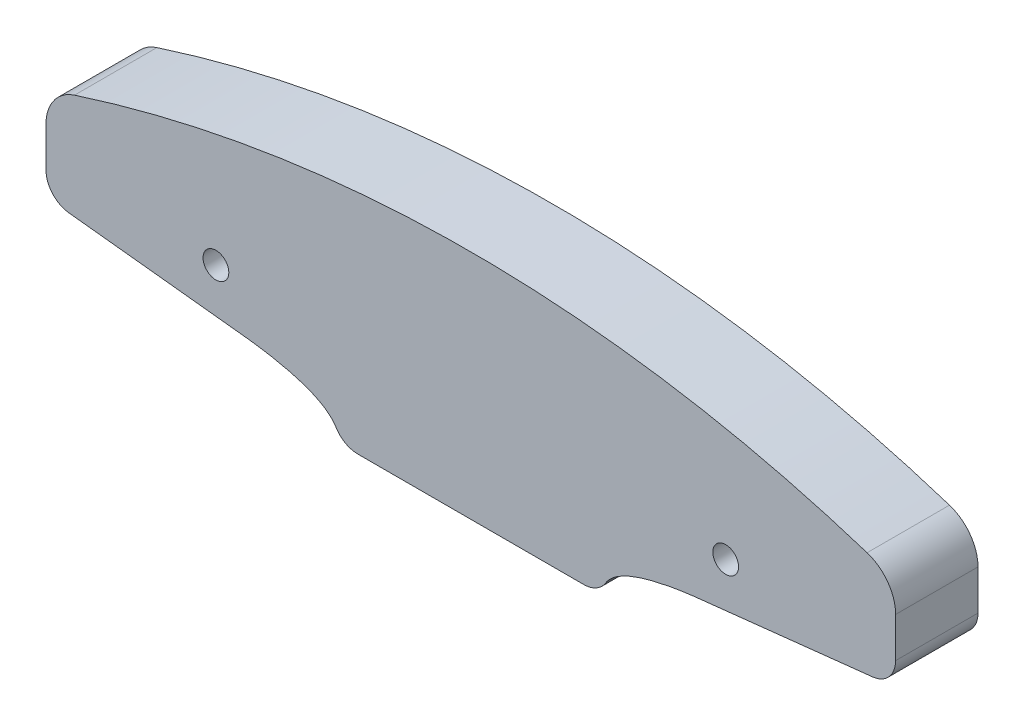
ISO-10303-21;
HEADER;
FILE_DESCRIPTION(('STEP AP214'),'2;1');
FILE_NAME('part.step','',(''),(''),'','','');
FILE_SCHEMA(('AUTOMOTIVE_DESIGN { 1 0 10303 214 1 1 1 1 }'));
ENDSEC;
DATA;
#1=APPLICATION_CONTEXT('core data for automotive mechanical design processes');
#2=APPLICATION_PROTOCOL_DEFINITION('international standard','automotive_design',2000,#1);
#3=PRODUCT_CONTEXT('',#1,'mechanical');
#4=PRODUCT('Part','Part','',(#3));
#5=PRODUCT_RELATED_PRODUCT_CATEGORY('part','',(#4));
#6=PRODUCT_DEFINITION_FORMATION('','',#4);
#7=PRODUCT_DEFINITION_CONTEXT('part definition',#1,'design');
#8=PRODUCT_DEFINITION('design','',#6,#7);
#9=PRODUCT_DEFINITION_SHAPE('','',#8);
#10=(LENGTH_UNIT() NAMED_UNIT(*) SI_UNIT(.MILLI.,.METRE.));
#11=(NAMED_UNIT(*) PLANE_ANGLE_UNIT() SI_UNIT($,.RADIAN.));
#12=(NAMED_UNIT(*) SI_UNIT($,.STERADIAN.) SOLID_ANGLE_UNIT());
#13=UNCERTAINTY_MEASURE_WITH_UNIT(LENGTH_MEASURE(1.E-05),#10,'distance_accuracy_value','');
#14=(GEOMETRIC_REPRESENTATION_CONTEXT(3) GLOBAL_UNCERTAINTY_ASSIGNED_CONTEXT((#13)) GLOBAL_UNIT_ASSIGNED_CONTEXT((#10,
#11,#12)) REPRESENTATION_CONTEXT('',''));
#15=CARTESIAN_POINT('',(0.,0.,0.));
#16=DIRECTION('',(0.,0.,1.));
#17=DIRECTION('',(1.,0.,0.));
#18=AXIS2_PLACEMENT_3D('',#15,#16,#17);
#19=CARTESIAN_POINT('',(25.5,0.,-8.));
#20=DIRECTION('',(0.,-1.,0.));
#21=DIRECTION('',(0.,0.,-1.));
#22=AXIS2_PLACEMENT_3D('',#19,#20,#21);
#23=PLANE('',#22);
#24=DIRECTION('',(1.,0.,0.));
#25=VECTOR('',#24,1.);
#26=CARTESIAN_POINT('',(25.5,0.,8.));
#27=LINE('',#26,#25);
#28=CARTESIAN_POINT('',(-21.9183722338467,0.,8.));
#29=VERTEX_POINT('',#28);
#30=CARTESIAN_POINT('',(21.9183722338467,0.,8.));
#31=VERTEX_POINT('',#30);
#32=EDGE_CURVE('E163',#29,#31,#27,.T.);
#33=ORIENTED_EDGE('',*,*,#32,.F.);
#34=DIRECTION('',(0.,0.,-1.));
#35=VECTOR('',#34,1.);
#36=CARTESIAN_POINT('',(-21.9183722338467,0.,-8.));
#37=LINE('',#36,#35);
#38=CARTESIAN_POINT('',(-21.9183722338467,0.,-8.));
#39=VERTEX_POINT('',#38);
#40=EDGE_CURVE('E324',#29,#39,#37,.T.);
#41=ORIENTED_EDGE('',*,*,#40,.T.);
#42=DIRECTION('',(1.,0.,0.));
#43=VECTOR('',#42,1.);
#44=CARTESIAN_POINT('',(25.5,0.,-8.));
#45=LINE('',#44,#43);
#46=CARTESIAN_POINT('',(21.9183722338467,0.,-8.));
#47=VERTEX_POINT('',#46);
#48=EDGE_CURVE('E239',#39,#47,#45,.T.);
#49=ORIENTED_EDGE('',*,*,#48,.T.);
#50=DIRECTION('',(0.,0.,1.));
#51=VECTOR('',#50,1.);
#52=CARTESIAN_POINT('',(21.9183722338467,0.,-8.));
#53=LINE('',#52,#51);
#54=EDGE_CURVE('E320',#47,#31,#53,.T.);
#55=ORIENTED_EDGE('',*,*,#54,.T.);
#56=EDGE_LOOP('',(#33,#41,#49,#55));
#57=FACE_BOUND('',#56,.T.);
#58=ADVANCED_FACE('F39',(#57),#23,.T.);
#59=CARTESIAN_POINT('',(0.,-205.080357142857,-8.));
#60=DIRECTION('',(0.,0.,1.));
#61=DIRECTION('',(1.,0.,0.));
#62=AXIS2_PLACEMENT_3D('',#59,#60,#61);
#63=CYLINDRICAL_SURFACE('',#62,250.080357142857);
#64=CARTESIAN_POINT('',(0.,-205.080357142857,-8.));
#65=DIRECTION('',(0.,0.,1.));
#66=DIRECTION('',(-1.,0.,0.));
#67=AXIS2_PLACEMENT_3D('',#64,#65,#66);
#68=CIRCLE('',#67,250.080357142857);
#69=CARTESIAN_POINT('',(76.9619924021687,32.862990640155,-8.));
#70=VERTEX_POINT('',#69);
#71=CARTESIAN_POINT('',(-76.9619924021687,32.862990640155,-8.));
#72=VERTEX_POINT('',#71);
#73=EDGE_CURVE('E250',#70,#72,#68,.T.);
#74=ORIENTED_EDGE('',*,*,#73,.T.);
#75=DIRECTION('',(0.,0.,1.));
#76=VECTOR('',#75,1.);
#77=CARTESIAN_POINT('',(-76.9619924021687,32.8629906401551,-8.));
#78=LINE('',#77,#76);
#79=CARTESIAN_POINT('',(-76.9619924021687,32.862990640155,8.));
#80=VERTEX_POINT('',#79);
#81=EDGE_CURVE('E261',#72,#80,#78,.T.);
#82=ORIENTED_EDGE('',*,*,#81,.T.);
#83=CARTESIAN_POINT('',(0.,-205.080357142857,8.));
#84=DIRECTION('',(0.,0.,1.));
#85=DIRECTION('',(-1.,0.,0.));
#86=AXIS2_PLACEMENT_3D('',#83,#84,#85);
#87=CIRCLE('',#86,250.080357142857);
#88=CARTESIAN_POINT('',(76.9619924021687,32.862990640155,8.));
#89=VERTEX_POINT('',#88);
#90=EDGE_CURVE('E353',#89,#80,#87,.T.);
#91=ORIENTED_EDGE('',*,*,#90,.F.);
#92=DIRECTION('',(0.,0.,1.));
#93=VECTOR('',#92,1.);
#94=CARTESIAN_POINT('',(76.9619924021687,32.8629906401551,-8.));
#95=LINE('',#94,#93);
#96=EDGE_CURVE('E258',#89,#70,#95,.F.);
#97=ORIENTED_EDGE('',*,*,#96,.T.);
#98=EDGE_LOOP('',(#74,#82,#91,#97));
#99=FACE_BOUND('',#98,.T.);
#100=ADVANCED_FACE('F215',(#99),#63,.T.);
#101=CARTESIAN_POINT('',(82.5,31.,-8.));
#102=DIRECTION('',(1.,0.,0.));
#103=DIRECTION('',(0.,0.,-1.));
#104=AXIS2_PLACEMENT_3D('',#101,#102,#103);
#105=PLANE('',#104);
#106=DIRECTION('',(0.,1.,0.));
#107=VECTOR('',#106,1.);
#108=CARTESIAN_POINT('',(82.5,31.,8.));
#109=LINE('',#108,#107);
#110=CARTESIAN_POINT('',(82.5,17.4829472913388,8.));
#111=VERTEX_POINT('',#110);
#112=CARTESIAN_POINT('',(82.5,25.2512501419731,8.));
#113=VERTEX_POINT('',#112);
#114=EDGE_CURVE('E351',#111,#113,#109,.T.);
#115=ORIENTED_EDGE('',*,*,#114,.F.);
#116=DIRECTION('',(0.,0.,1.));
#117=VECTOR('',#116,1.);
#118=CARTESIAN_POINT('',(82.5,17.4829472913388,-8.));
#119=LINE('',#118,#117);
#120=CARTESIAN_POINT('',(82.5,17.4829472913388,-8.));
#121=VERTEX_POINT('',#120);
#122=EDGE_CURVE('E309',#111,#121,#119,.F.);
#123=ORIENTED_EDGE('',*,*,#122,.T.);
#124=DIRECTION('',(0.,1.,0.));
#125=VECTOR('',#124,1.);
#126=CARTESIAN_POINT('',(82.5,31.,-8.));
#127=LINE('',#126,#125);
#128=CARTESIAN_POINT('',(82.5,25.2512501419731,-8.));
#129=VERTEX_POINT('',#128);
#130=EDGE_CURVE('E247',#121,#129,#127,.T.);
#131=ORIENTED_EDGE('',*,*,#130,.T.);
#132=DIRECTION('',(0.,0.,1.));
#133=VECTOR('',#132,1.);
#134=CARTESIAN_POINT('',(82.5,25.2512501419731,-8.));
#135=LINE('',#134,#133);
#136=EDGE_CURVE('E283',#129,#113,#135,.T.);
#137=ORIENTED_EDGE('',*,*,#136,.T.);
#138=EDGE_LOOP('',(#115,#123,#131,#137));
#139=FACE_BOUND('',#138,.T.);
#140=ADVANCED_FACE('F218',(#139),#105,.T.);
#141=CARTESIAN_POINT('',(82.5,13.,-8.));
#142=DIRECTION('',(0.108725714421789,-0.994071787660967,0.));
#143=DIRECTION('',(0.994071787660967,0.108725714421789,0.));
#144=AXIS2_PLACEMENT_3D('',#141,#142,#143);
#145=PLANE('',#144);
#146=DIRECTION('',(0.994071787660967,0.108725714421789,0.));
#147=VECTOR('',#146,1.);
#148=CARTESIAN_POINT('',(82.5,13.,-8.));
#149=LINE('',#148,#147);
#150=CARTESIAN_POINT('',(43.1656829731963,8.69784418679131,-8.));
#151=VERTEX_POINT('',#150);
#152=CARTESIAN_POINT('',(78.0436285721089,12.512588353034,-8.));
#153=VERTEX_POINT('',#152);
#154=EDGE_CURVE('E238',#151,#153,#149,.T.);
#155=ORIENTED_EDGE('',*,*,#154,.T.);
#156=DIRECTION('',(0.,0.,1.));
#157=VECTOR('',#156,1.);
#158=CARTESIAN_POINT('',(78.0436285721089,12.512588353034,-8.));
#159=LINE('',#158,#157);
#160=CARTESIAN_POINT('',(78.0436285721089,12.512588353034,8.));
#161=VERTEX_POINT('',#160);
#162=EDGE_CURVE('E305',#153,#161,#159,.T.);
#163=ORIENTED_EDGE('',*,*,#162,.T.);
#164=DIRECTION('',(0.994071787660967,0.108725714421789,0.));
#165=VECTOR('',#164,1.);
#166=CARTESIAN_POINT('',(82.5,13.,8.));
#167=LINE('',#166,#165);
#168=CARTESIAN_POINT('',(43.1656829731963,8.69784418679131,8.));
#169=VERTEX_POINT('',#168);
#170=EDGE_CURVE('E340',#169,#161,#167,.T.);
#171=ORIENTED_EDGE('',*,*,#170,.F.);
#172=DIRECTION('',(0.,0.,1.));
#173=VECTOR('',#172,1.);
#174=CARTESIAN_POINT('',(43.1656829731963,8.69784418679131,-8.));
#175=LINE('',#174,#173);
#176=EDGE_CURVE('E254',#151,#169,#175,.T.);
#177=ORIENTED_EDGE('',*,*,#176,.F.);
#178=EDGE_LOOP('',(#155,#163,#171,#177));
#179=FACE_BOUND('',#178,.T.);
#180=ADVANCED_FACE('F222',(#179),#145,.T.);
#181=CARTESIAN_POINT('',(25.5,0.,-8.));
#182=CARTESIAN_POINT('',(25.5,6.5,-8.));
#183=CARTESIAN_POINT('',(43.1656829731963,8.69784418679131,-8.));
#184=B_SPLINE_CURVE_WITH_KNOTS('',2,(#181,#182,#183),.UNSPECIFIED.,.F.,.F.,(3,3),(0.,1.),.UNSPECIFIED.);
#185=DIRECTION('',(0.,0.,1.));
#186=VECTOR('',#185,1.);
#187=SURFACE_OF_LINEAR_EXTRUSION('',#184,#186);
#188=CARTESIAN_POINT('',(25.5,0.,8.));
#189=CARTESIAN_POINT('',(25.5,6.5,8.));
#190=CARTESIAN_POINT('',(43.1656829731963,8.69784418679131,8.));
#191=B_SPLINE_CURVE_WITH_KNOTS('',2,(#188,#189,#190),.UNSPECIFIED.,.F.,.F.,(3,3),(0.,1.),.UNSPECIFIED.);
#192=CARTESIAN_POINT('',(26.1807987103924,2.3862439800083,8.));
#193=VERTEX_POINT('',#192);
#194=EDGE_CURVE('E338',#193,#169,#191,.T.);
#195=ORIENTED_EDGE('',*,*,#194,.F.);
#196=DIRECTION('',(0.,0.,1.));
#197=VECTOR('',#196,1.);
#198=CARTESIAN_POINT('',(26.1807987103924,2.3862439800083,8.));
#199=LINE('',#198,#197);
#200=CARTESIAN_POINT('',(26.1807987103924,2.3862439800083,-8.));
#201=VERTEX_POINT('',#200);
#202=EDGE_CURVE('E11',#193,#201,#199,.F.);
#203=ORIENTED_EDGE('',*,*,#202,.T.);
#204=EDGE_CURVE('E231',#201,#151,#184,.T.);
#205=ORIENTED_EDGE('',*,*,#204,.T.);
#206=ORIENTED_EDGE('',*,*,#176,.T.);
#207=EDGE_LOOP('',(#195,#203,#205,#206));
#208=FACE_BOUND('',#207,.T.);
#209=ADVANCED_FACE('F213',(#208),#187,.T.);
#210=CARTESIAN_POINT('',(0.,-205.080357142857,-8.));
#211=DIRECTION('',(0.,0.,-1.));
#212=DIRECTION('',(-1.,0.,0.));
#213=AXIS2_PLACEMENT_3D('',#210,#211,#212);
#214=PLANE('',#213);
#215=CARTESIAN_POINT('',(-49.5,18.,-8.));
#216=DIRECTION('',(0.,0.,-1.));
#217=DIRECTION('',(-1.,0.,0.));
#218=AXIS2_PLACEMENT_3D('',#215,#216,#217);
#219=CIRCLE('',#218,2.5);
#220=CARTESIAN_POINT('',(-52.,18.,-8.));
#221=VERTEX_POINT('',#220);
#222=EDGE_CURVE('E491',#221,#221,#219,.T.);
#223=ORIENTED_EDGE('',*,*,#222,.F.);
#224=EDGE_LOOP('',(#223));
#225=FACE_BOUND('',#224,.T.);
#226=CARTESIAN_POINT('',(49.5,18.,-8.));
#227=DIRECTION('',(0.,0.,1.));
#228=DIRECTION('',(1.,0.,0.));
#229=AXIS2_PLACEMENT_3D('',#226,#227,#228);
#230=CIRCLE('',#229,2.5);
#231=CARTESIAN_POINT('',(52.,18.,-8.));
#232=VERTEX_POINT('',#231);
#233=EDGE_CURVE('E173',#232,#232,#230,.T.);
#234=ORIENTED_EDGE('',*,*,#233,.T.);
#235=EDGE_LOOP('',(#234));
#236=FACE_BOUND('',#235,.T.);
#237=ORIENTED_EDGE('',*,*,#48,.F.);
#238=CARTESIAN_POINT('',(-21.9183722338467,5.,-8.));
#239=DIRECTION('',(0.,0.,-1.));
#240=DIRECTION('',(-1.,0.,0.));
#241=AXIS2_PLACEMENT_3D('',#238,#239,#240);
#242=CIRCLE('',#241,5.);
#243=CARTESIAN_POINT('',(-26.1807987103924,2.38624398000829,-8.));
#244=VERTEX_POINT('',#243);
#245=EDGE_CURVE('E48',#39,#244,#242,.T.);
#246=ORIENTED_EDGE('',*,*,#245,.T.);
#247=CARTESIAN_POINT('',(-25.5,0.,-8.));
#248=CARTESIAN_POINT('',(-25.5,6.5,-8.));
#249=CARTESIAN_POINT('',(-43.1656829731963,8.69784418679131,-8.));
#250=B_SPLINE_CURVE_WITH_KNOTS('',2,(#247,#248,#249),.UNSPECIFIED.,.F.,.F.,(3,3),(0.,1.),.UNSPECIFIED.);
#251=CARTESIAN_POINT('',(-43.1656829731963,8.69784418679131,-8.));
#252=VERTEX_POINT('',#251);
#253=EDGE_CURVE('E164',#244,#252,#250,.T.);
#254=ORIENTED_EDGE('',*,*,#253,.T.);
#255=DIRECTION('',(-0.994071787660967,0.108725714421789,0.));
#256=VECTOR('',#255,1.);
#257=CARTESIAN_POINT('',(-82.5,13.,-8.));
#258=LINE('',#257,#256);
#259=CARTESIAN_POINT('',(-78.0436285721089,12.512588353034,-8.));
#260=VERTEX_POINT('',#259);
#261=EDGE_CURVE('E161',#252,#260,#258,.T.);
#262=ORIENTED_EDGE('',*,*,#261,.T.);
#263=CARTESIAN_POINT('',(-77.5,17.4829472913388,-8.));
#264=DIRECTION('',(0.,0.,-1.));
#265=DIRECTION('',(-1.,0.,0.));
#266=AXIS2_PLACEMENT_3D('',#263,#264,#265);
#267=CIRCLE('',#266,5.);
#268=CARTESIAN_POINT('',(-82.5,17.4829472913388,-8.));
#269=VERTEX_POINT('',#268);
#270=EDGE_CURVE('E302',#260,#269,#267,.T.);
#271=ORIENTED_EDGE('',*,*,#270,.T.);
#272=DIRECTION('',(0.,1.,0.));
#273=VECTOR('',#272,1.);
#274=CARTESIAN_POINT('',(-82.5,31.,-8.));
#275=LINE('',#274,#273);
#276=CARTESIAN_POINT('',(-82.5,25.2512501419731,-8.));
#277=VERTEX_POINT('',#276);
#278=EDGE_CURVE('E153',#269,#277,#275,.T.);
#279=ORIENTED_EDGE('',*,*,#278,.T.);
#280=CARTESIAN_POINT('',(-74.5,25.2512501419731,-8.));
#281=DIRECTION('',(0.,0.,-1.));
#282=DIRECTION('',(-1.,0.,0.));
#283=AXIS2_PLACEMENT_3D('',#280,#281,#282);
#284=CIRCLE('',#283,8.);
#285=EDGE_CURVE('E280',#277,#72,#284,.T.);
#286=ORIENTED_EDGE('',*,*,#285,.T.);
#287=ORIENTED_EDGE('',*,*,#73,.F.);
#288=CARTESIAN_POINT('',(74.5,25.2512501419731,-8.));
#289=DIRECTION('',(0.,0.,-1.));
#290=DIRECTION('',(-1.,0.,0.));
#291=AXIS2_PLACEMENT_3D('',#288,#289,#290);
#292=CIRCLE('',#291,8.);
#293=EDGE_CURVE('E276',#70,#129,#292,.T.);
#294=ORIENTED_EDGE('',*,*,#293,.T.);
#295=ORIENTED_EDGE('',*,*,#130,.F.);
#296=CARTESIAN_POINT('',(77.5,17.4829472913388,-8.));
#297=DIRECTION('',(0.,0.,-1.));
#298=DIRECTION('',(-1.,0.,0.));
#299=AXIS2_PLACEMENT_3D('',#296,#297,#298);
#300=CIRCLE('',#299,5.);
#301=EDGE_CURVE('E299',#121,#153,#300,.T.);
#302=ORIENTED_EDGE('',*,*,#301,.T.);
#303=ORIENTED_EDGE('',*,*,#154,.F.);
#304=ORIENTED_EDGE('',*,*,#204,.F.);
#305=CARTESIAN_POINT('',(21.9183722338467,5.00000000000001,-8.));
#306=DIRECTION('',(0.,0.,-1.));
#307=DIRECTION('',(-1.,0.,0.));
#308=AXIS2_PLACEMENT_3D('',#305,#306,#307);
#309=CIRCLE('',#308,5.);
#310=EDGE_CURVE('E60',#201,#47,#309,.T.);
#311=ORIENTED_EDGE('',*,*,#310,.T.);
#312=EDGE_LOOP('',(#237,#246,#254,#262,#271,#279,#286,#287,#294,#295,#302,#303,#304,#311));
#313=FACE_BOUND('',#312,.T.);
#314=ADVANCED_FACE('F209',(#225,#236,#313),#214,.T.);
#315=CARTESIAN_POINT('',(0.,-205.080357142857,8.));
#316=DIRECTION('',(0.,0.,-1.));
#317=DIRECTION('',(-1.,0.,0.));
#318=AXIS2_PLACEMENT_3D('',#315,#316,#317);
#319=PLANE('',#318);
#320=CARTESIAN_POINT('',(-49.5,18.,8.));
#321=DIRECTION('',(0.,0.,-1.));
#322=DIRECTION('',(-1.,0.,0.));
#323=AXIS2_PLACEMENT_3D('',#320,#321,#322);
#324=CIRCLE('',#323,2.5);
#325=CARTESIAN_POINT('',(-52.,18.,8.));
#326=VERTEX_POINT('',#325);
#327=EDGE_CURVE('E494',#326,#326,#324,.T.);
#328=ORIENTED_EDGE('',*,*,#327,.T.);
#329=EDGE_LOOP('',(#328));
#330=FACE_BOUND('',#329,.T.);
#331=CARTESIAN_POINT('',(49.5,18.,8.));
#332=DIRECTION('',(0.,0.,1.));
#333=DIRECTION('',(1.,0.,0.));
#334=AXIS2_PLACEMENT_3D('',#331,#332,#333);
#335=CIRCLE('',#334,2.5);
#336=CARTESIAN_POINT('',(52.,18.,8.));
#337=VERTEX_POINT('',#336);
#338=EDGE_CURVE('E498',#337,#337,#335,.T.);
#339=ORIENTED_EDGE('',*,*,#338,.F.);
#340=EDGE_LOOP('',(#339));
#341=FACE_BOUND('',#340,.T.);
#342=CARTESIAN_POINT('',(-25.5,0.,8.));
#343=CARTESIAN_POINT('',(-25.5,6.5,8.));
#344=CARTESIAN_POINT('',(-43.1656829731963,8.69784418679131,8.));
#345=B_SPLINE_CURVE_WITH_KNOTS('',2,(#342,#343,#344),.UNSPECIFIED.,.F.,.F.,(3,3),(0.,1.),.UNSPECIFIED.);
#346=CARTESIAN_POINT('',(-26.1807987103924,2.38624398000829,8.));
#347=VERTEX_POINT('',#346);
#348=CARTESIAN_POINT('',(-43.1656829731963,8.69784418679131,8.));
#349=VERTEX_POINT('',#348);
#350=EDGE_CURVE('E142',#347,#349,#345,.T.);
#351=ORIENTED_EDGE('',*,*,#350,.F.);
#352=CARTESIAN_POINT('',(-21.9183722338467,5.,8.));
#353=DIRECTION('',(0.,0.,-1.));
#354=DIRECTION('',(-1.,0.,0.));
#355=AXIS2_PLACEMENT_3D('',#352,#353,#354);
#356=CIRCLE('',#355,5.);
#357=EDGE_CURVE('E317',#347,#29,#356,.F.);
#358=ORIENTED_EDGE('',*,*,#357,.T.);
#359=ORIENTED_EDGE('',*,*,#32,.T.);
#360=CARTESIAN_POINT('',(21.9183722338467,5.00000000000001,8.));
#361=DIRECTION('',(0.,0.,-1.));
#362=DIRECTION('',(-1.,0.,0.));
#363=AXIS2_PLACEMENT_3D('',#360,#361,#362);
#364=CIRCLE('',#363,5.);
#365=EDGE_CURVE('E314',#31,#193,#364,.F.);
#366=ORIENTED_EDGE('',*,*,#365,.T.);
#367=ORIENTED_EDGE('',*,*,#194,.T.);
#368=ORIENTED_EDGE('',*,*,#170,.T.);
#369=CARTESIAN_POINT('',(77.5,17.4829472913388,8.));
#370=DIRECTION('',(0.,0.,-1.));
#371=DIRECTION('',(-1.,0.,0.));
#372=AXIS2_PLACEMENT_3D('',#369,#370,#371);
#373=CIRCLE('',#372,5.);
#374=EDGE_CURVE('E291',#161,#111,#373,.F.);
#375=ORIENTED_EDGE('',*,*,#374,.T.);
#376=ORIENTED_EDGE('',*,*,#114,.T.);
#377=CARTESIAN_POINT('',(74.5,25.2512501419731,8.));
#378=DIRECTION('',(0.,0.,-1.));
#379=DIRECTION('',(-1.,0.,0.));
#380=AXIS2_PLACEMENT_3D('',#377,#378,#379);
#381=CIRCLE('',#380,8.);
#382=EDGE_CURVE('E265',#113,#89,#381,.F.);
#383=ORIENTED_EDGE('',*,*,#382,.T.);
#384=ORIENTED_EDGE('',*,*,#90,.T.);
#385=CARTESIAN_POINT('',(-74.5,25.2512501419731,8.));
#386=DIRECTION('',(0.,0.,-1.));
#387=DIRECTION('',(-1.,0.,0.));
#388=AXIS2_PLACEMENT_3D('',#385,#386,#387);
#389=CIRCLE('',#388,8.);
#390=CARTESIAN_POINT('',(-82.5,25.2512501419731,8.));
#391=VERTEX_POINT('',#390);
#392=EDGE_CURVE('E268',#80,#391,#389,.F.);
#393=ORIENTED_EDGE('',*,*,#392,.T.);
#394=DIRECTION('',(0.,1.,0.));
#395=VECTOR('',#394,1.);
#396=CARTESIAN_POINT('',(-82.5,31.,8.));
#397=LINE('',#396,#395);
#398=CARTESIAN_POINT('',(-82.5,17.4829472913388,8.));
#399=VERTEX_POINT('',#398);
#400=EDGE_CURVE('E170',#399,#391,#397,.T.);
#401=ORIENTED_EDGE('',*,*,#400,.F.);
#402=CARTESIAN_POINT('',(-77.5,17.4829472913388,8.));
#403=DIRECTION('',(0.,0.,-1.));
#404=DIRECTION('',(-1.,0.,0.));
#405=AXIS2_PLACEMENT_3D('',#402,#403,#404);
#406=CIRCLE('',#405,5.);
#407=CARTESIAN_POINT('',(-78.0436285721089,12.512588353034,8.));
#408=VERTEX_POINT('',#407);
#409=EDGE_CURVE('E168',#399,#408,#406,.F.);
#410=ORIENTED_EDGE('',*,*,#409,.T.);
#411=DIRECTION('',(-0.994071787660967,0.108725714421789,0.));
#412=VECTOR('',#411,1.);
#413=CARTESIAN_POINT('',(-82.5,13.,8.));
#414=LINE('',#413,#412);
#415=EDGE_CURVE('E154',#349,#408,#414,.T.);
#416=ORIENTED_EDGE('',*,*,#415,.F.);
#417=EDGE_LOOP('',(#351,#358,#359,#366,#367,#368,#375,#376,#383,#384,#393,#401,#410,#416));
#418=FACE_BOUND('',#417,.T.);
#419=ADVANCED_FACE('F166',(#330,#341,#418),#319,.F.);
#420=DIRECTION('',(0.,0.,1.));
#421=VECTOR('',#420,1.);
#422=SURFACE_OF_LINEAR_EXTRUSION('',#250,#421);
#423=ORIENTED_EDGE('',*,*,#253,.F.);
#424=DIRECTION('',(0.,0.,1.));
#425=VECTOR('',#424,1.);
#426=CARTESIAN_POINT('',(-26.1807987103924,2.3862439800083,-8.));
#427=LINE('',#426,#425);
#428=EDGE_CURVE('E149',#244,#347,#427,.T.);
#429=ORIENTED_EDGE('',*,*,#428,.T.);
#430=ORIENTED_EDGE('',*,*,#350,.T.);
#431=DIRECTION('',(0.,0.,1.));
#432=VECTOR('',#431,1.);
#433=CARTESIAN_POINT('',(-43.1656829731963,8.69784418679131,-8.));
#434=LINE('',#433,#432);
#435=EDGE_CURVE('E146',#252,#349,#434,.T.);
#436=ORIENTED_EDGE('',*,*,#435,.F.);
#437=EDGE_LOOP('',(#423,#429,#430,#436));
#438=FACE_BOUND('',#437,.T.);
#439=ADVANCED_FACE('F145',(#438),#422,.F.);
#440=CARTESIAN_POINT('',(-82.5,13.,-8.));
#441=DIRECTION('',(0.108725714421789,0.994071787660967,0.));
#442=DIRECTION('',(-0.994071787660967,0.108725714421789,0.));
#443=AXIS2_PLACEMENT_3D('',#440,#441,#442);
#444=PLANE('',#443);
#445=ORIENTED_EDGE('',*,*,#415,.T.);
#446=DIRECTION('',(0.,0.,1.));
#447=VECTOR('',#446,1.);
#448=CARTESIAN_POINT('',(-78.0436285721089,12.512588353034,-8.));
#449=LINE('',#448,#447);
#450=EDGE_CURVE('E296',#408,#260,#449,.F.);
#451=ORIENTED_EDGE('',*,*,#450,.T.);
#452=ORIENTED_EDGE('',*,*,#261,.F.);
#453=ORIENTED_EDGE('',*,*,#435,.T.);
#454=EDGE_LOOP('',(#445,#451,#452,#453));
#455=FACE_BOUND('',#454,.T.);
#456=ADVANCED_FACE('F158',(#455),#444,.F.);
#457=CARTESIAN_POINT('',(-82.5,31.,-8.));
#458=DIRECTION('',(1.,0.,0.));
#459=DIRECTION('',(0.,0.,-1.));
#460=AXIS2_PLACEMENT_3D('',#457,#458,#459);
#461=PLANE('',#460);
#462=ORIENTED_EDGE('',*,*,#278,.F.);
#463=DIRECTION('',(0.,0.,1.));
#464=VECTOR('',#463,1.);
#465=CARTESIAN_POINT('',(-82.5,17.4829472913388,-8.));
#466=LINE('',#465,#464);
#467=EDGE_CURVE('E287',#269,#399,#466,.T.);
#468=ORIENTED_EDGE('',*,*,#467,.T.);
#469=ORIENTED_EDGE('',*,*,#400,.T.);
#470=DIRECTION('',(0.,0.,-1.));
#471=VECTOR('',#470,1.);
#472=CARTESIAN_POINT('',(-82.5,25.2512501419731,-8.));
#473=LINE('',#472,#471);
#474=EDGE_CURVE('E272',#391,#277,#473,.T.);
#475=ORIENTED_EDGE('',*,*,#474,.T.);
#476=EDGE_LOOP('',(#462,#468,#469,#475));
#477=FACE_BOUND('',#476,.T.);
#478=ADVANCED_FACE('F202',(#477),#461,.F.);
#479=CARTESIAN_POINT('',(-74.5,25.2512501419731,-8.));
#480=DIRECTION('',(0.,0.,1.));
#481=DIRECTION('',(1.,0.,0.));
#482=AXIS2_PLACEMENT_3D('',#479,#480,#481);
#483=CYLINDRICAL_SURFACE('',#482,8.);
#484=ORIENTED_EDGE('',*,*,#285,.F.);
#485=ORIENTED_EDGE('',*,*,#474,.F.);
#486=ORIENTED_EDGE('',*,*,#392,.F.);
#487=ORIENTED_EDGE('',*,*,#81,.F.);
#488=EDGE_LOOP('',(#484,#485,#486,#487));
#489=FACE_BOUND('',#488,.T.);
#490=ADVANCED_FACE('F205',(#489),#483,.T.);
#491=CARTESIAN_POINT('',(74.5,25.2512501419731,-8.));
#492=DIRECTION('',(0.,0.,1.));
#493=DIRECTION('',(1.,0.,0.));
#494=AXIS2_PLACEMENT_3D('',#491,#492,#493);
#495=CYLINDRICAL_SURFACE('',#494,8.);
#496=ORIENTED_EDGE('',*,*,#293,.F.);
#497=ORIENTED_EDGE('',*,*,#96,.F.);
#498=ORIENTED_EDGE('',*,*,#382,.F.);
#499=ORIENTED_EDGE('',*,*,#136,.F.);
#500=EDGE_LOOP('',(#496,#497,#498,#499));
#501=FACE_BOUND('',#500,.T.);
#502=ADVANCED_FACE('F375',(#501),#495,.T.);
#503=CARTESIAN_POINT('',(-77.5,17.4829472913388,-8.));
#504=DIRECTION('',(0.,0.,1.));
#505=DIRECTION('',(1.,0.,0.));
#506=AXIS2_PLACEMENT_3D('',#503,#504,#505);
#507=CYLINDRICAL_SURFACE('',#506,5.);
#508=ORIENTED_EDGE('',*,*,#270,.F.);
#509=ORIENTED_EDGE('',*,*,#450,.F.);
#510=ORIENTED_EDGE('',*,*,#409,.F.);
#511=ORIENTED_EDGE('',*,*,#467,.F.);
#512=EDGE_LOOP('',(#508,#509,#510,#511));
#513=FACE_BOUND('',#512,.T.);
#514=ADVANCED_FACE('F384',(#513),#507,.T.);
#515=CARTESIAN_POINT('',(77.5,17.4829472913388,-8.));
#516=DIRECTION('',(0.,0.,1.));
#517=DIRECTION('',(1.,0.,0.));
#518=AXIS2_PLACEMENT_3D('',#515,#516,#517);
#519=CYLINDRICAL_SURFACE('',#518,5.);
#520=ORIENTED_EDGE('',*,*,#301,.F.);
#521=ORIENTED_EDGE('',*,*,#122,.F.);
#522=ORIENTED_EDGE('',*,*,#374,.F.);
#523=ORIENTED_EDGE('',*,*,#162,.F.);
#524=EDGE_LOOP('',(#520,#521,#522,#523));
#525=FACE_BOUND('',#524,.T.);
#526=ADVANCED_FACE('F370',(#525),#519,.T.);
#527=CARTESIAN_POINT('',(-21.9183722338467,5.,0.));
#528=DIRECTION('',(0.,0.,1.));
#529=DIRECTION('',(1.,0.,0.));
#530=AXIS2_PLACEMENT_3D('',#527,#528,#529);
#531=CYLINDRICAL_SURFACE('',#530,5.);
#532=ORIENTED_EDGE('',*,*,#245,.F.);
#533=ORIENTED_EDGE('',*,*,#40,.F.);
#534=ORIENTED_EDGE('',*,*,#357,.F.);
#535=ORIENTED_EDGE('',*,*,#428,.F.);
#536=EDGE_LOOP('',(#532,#533,#534,#535));
#537=FACE_BOUND('',#536,.T.);
#538=ADVANCED_FACE('F332',(#537),#531,.T.);
#539=CARTESIAN_POINT('',(21.9183722338467,5.00000000000001,0.));
#540=DIRECTION('',(0.,0.,1.));
#541=DIRECTION('',(1.,0.,0.));
#542=AXIS2_PLACEMENT_3D('',#539,#540,#541);
#543=CYLINDRICAL_SURFACE('',#542,5.);
#544=ORIENTED_EDGE('',*,*,#310,.F.);
#545=ORIENTED_EDGE('',*,*,#202,.F.);
#546=ORIENTED_EDGE('',*,*,#365,.F.);
#547=ORIENTED_EDGE('',*,*,#54,.F.);
#548=EDGE_LOOP('',(#544,#545,#546,#547));
#549=FACE_BOUND('',#548,.T.);
#550=ADVANCED_FACE('F41',(#549),#543,.T.);
#551=CARTESIAN_POINT('',(49.5,18.,-8.));
#552=DIRECTION('',(0.,0.,1.));
#553=DIRECTION('',(1.,0.,0.));
#554=AXIS2_PLACEMENT_3D('',#551,#552,#553);
#555=CYLINDRICAL_SURFACE('',#554,2.5);
#556=ORIENTED_EDGE('',*,*,#233,.F.);
#557=EDGE_LOOP('',(#556));
#558=FACE_BOUND('',#557,.T.);
#559=ORIENTED_EDGE('',*,*,#338,.T.);
#560=EDGE_LOOP('',(#559));
#561=FACE_BOUND('',#560,.T.);
#562=ADVANCED_FACE('F198',(#558,#561),#555,.F.);
#563=CARTESIAN_POINT('',(-49.5,18.,-8.));
#564=DIRECTION('',(0.,0.,1.));
#565=DIRECTION('',(1.,0.,0.));
#566=AXIS2_PLACEMENT_3D('',#563,#564,#565);
#567=CYLINDRICAL_SURFACE('',#566,2.5);
#568=ORIENTED_EDGE('',*,*,#222,.T.);
#569=EDGE_LOOP('',(#568));
#570=FACE_BOUND('',#569,.T.);
#571=ORIENTED_EDGE('',*,*,#327,.F.);
#572=EDGE_LOOP('',(#571));
#573=FACE_BOUND('',#572,.T.);
#574=ADVANCED_FACE('F475',(#570,#573),#567,.F.);
#575=CLOSED_SHELL('',(#58,#100,#140,#180,#209,#314,#419,#439,#456,#478,#490,#502,#514,#526,#538,
#550,#562,#574));
#576=MANIFOLD_SOLID_BREP('B2',#575);
#577=ADVANCED_BREP_SHAPE_REPRESENTATION('',(#18,#576),#14);
#578=SHAPE_DEFINITION_REPRESENTATION(#9,#577);
ENDSEC;
END-ISO-10303-21;
